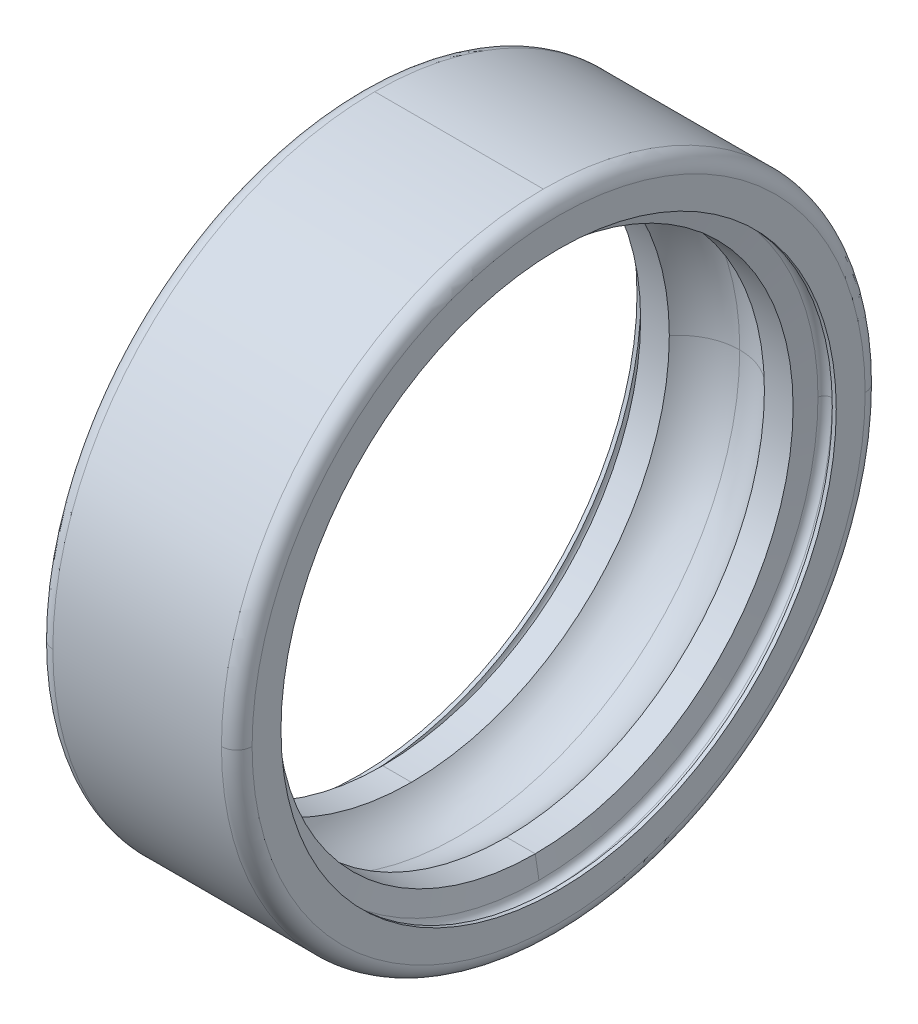
ISO-10303-21;
HEADER;
FILE_DESCRIPTION(('STEP AP214'),'2;1');
FILE_NAME('part.step','',(''),(''),'','','');
FILE_SCHEMA(('AUTOMOTIVE_DESIGN { 1 0 10303 214 1 1 1 1 }'));
ENDSEC;
DATA;
#1=APPLICATION_CONTEXT('core data for automotive mechanical design processes');
#2=APPLICATION_PROTOCOL_DEFINITION('international standard','automotive_design',2000,#1);
#3=PRODUCT_CONTEXT('',#1,'mechanical');
#4=PRODUCT('Part','Part','',(#3));
#5=PRODUCT_RELATED_PRODUCT_CATEGORY('part','',(#4));
#6=PRODUCT_DEFINITION_FORMATION('','',#4);
#7=PRODUCT_DEFINITION_CONTEXT('part definition',#1,'design');
#8=PRODUCT_DEFINITION('design','',#6,#7);
#9=PRODUCT_DEFINITION_SHAPE('','',#8);
#10=(LENGTH_UNIT() NAMED_UNIT(*) SI_UNIT(.MILLI.,.METRE.));
#11=(NAMED_UNIT(*) PLANE_ANGLE_UNIT() SI_UNIT($,.RADIAN.));
#12=(NAMED_UNIT(*) SI_UNIT($,.STERADIAN.) SOLID_ANGLE_UNIT());
#13=UNCERTAINTY_MEASURE_WITH_UNIT(LENGTH_MEASURE(1.E-05),#10,'distance_accuracy_value','');
#14=(GEOMETRIC_REPRESENTATION_CONTEXT(3) GLOBAL_UNCERTAINTY_ASSIGNED_CONTEXT((#13)) GLOBAL_UNIT_ASSIGNED_CONTEXT((#10,
#11,#12)) REPRESENTATION_CONTEXT('',''));
#15=CARTESIAN_POINT('',(0.,0.,0.));
#16=DIRECTION('',(0.,0.,1.));
#17=DIRECTION('',(1.,0.,0.));
#18=AXIS2_PLACEMENT_3D('',#15,#16,#17);
#19=CARTESIAN_POINT('',(12.226,0.,0.));
#20=DIRECTION('',(1.,0.,0.));
#21=DIRECTION('',(0.,0.,-1.));
#22=AXIS2_PLACEMENT_3D('',#19,#20,#21);
#23=TOROIDAL_SURFACE('',#22,18.115,0.516);
#24=CARTESIAN_POINT('',(12.226,0.,0.));
#25=DIRECTION('',(1.,0.,0.));
#26=DIRECTION('',(0.,0.,1.));
#27=AXIS2_PLACEMENT_3D('',#24,#25,#26);
#28=CIRCLE('',#27,18.631);
#29=CARTESIAN_POINT('',(12.226,0.,-18.631));
#30=VERTEX_POINT('',#29);
#31=CARTESIAN_POINT('',(12.226,0.,18.631));
#32=VERTEX_POINT('',#31);
#33=EDGE_CURVE('E206',#30,#32,#28,.T.);
#34=ORIENTED_EDGE('',*,*,#33,.T.);
#35=CARTESIAN_POINT('',(12.226,0.,18.115));
#36=DIRECTION('',(0.,-1.,0.));
#37=DIRECTION('',(0.,0.,1.));
#38=AXIS2_PLACEMENT_3D('',#35,#36,#37);
#39=CIRCLE('',#38,0.516);
#40=CARTESIAN_POINT('',(11.7178391994457,0.,18.2046024596761));
#41=VERTEX_POINT('',#40);
#42=EDGE_CURVE('E204',#32,#41,#39,.T.);
#43=ORIENTED_EDGE('',*,*,#42,.T.);
#44=CARTESIAN_POINT('',(11.7178391994457,0.,0.));
#45=DIRECTION('',(1.,0.,0.));
#46=DIRECTION('',(0.,1.,0.));
#47=AXIS2_PLACEMENT_3D('',#44,#45,#46);
#48=CIRCLE('',#47,18.2046024596761);
#49=CARTESIAN_POINT('',(11.7178391994457,18.2046024596761,0.));
#50=VERTEX_POINT('',#49);
#51=EDGE_CURVE('E31',#50,#41,#48,.T.);
#52=ORIENTED_EDGE('',*,*,#51,.F.);
#53=CARTESIAN_POINT('',(11.7178391994457,0.,0.));
#54=DIRECTION('',(1.,0.,0.));
#55=DIRECTION('',(0.,1.,0.));
#56=AXIS2_PLACEMENT_3D('',#53,#54,#55);
#57=CIRCLE('',#56,18.2046024596761);
#58=CARTESIAN_POINT('',(11.7178391994457,0.,-18.2046024596761));
#59=VERTEX_POINT('',#58);
#60=EDGE_CURVE('E201',#59,#50,#57,.T.);
#61=ORIENTED_EDGE('',*,*,#60,.F.);
#62=CARTESIAN_POINT('',(12.226,0.,-18.115));
#63=DIRECTION('',(0.,-1.,0.));
#64=DIRECTION('',(0.,0.,-1.));
#65=AXIS2_PLACEMENT_3D('',#62,#63,#64);
#66=CIRCLE('',#65,0.516);
#67=EDGE_CURVE('E216',#59,#30,#66,.T.);
#68=ORIENTED_EDGE('',*,*,#67,.T.);
#69=EDGE_LOOP('',(#34,#43,#52,#61,#68));
#70=FACE_BOUND('',#69,.T.);
#71=ADVANCED_FACE('F15',(#70),#23,.F.);
#72=CARTESIAN_POINT('',(12.871,0.,0.));
#73=DIRECTION('',(1.,0.,0.));
#74=DIRECTION('',(0.,1.,0.));
#75=AXIS2_PLACEMENT_3D('',#72,#73,#74);
#76=CYLINDRICAL_SURFACE('',#75,18.115);
#77=DIRECTION('',(1.,0.,0.));
#78=VECTOR('',#77,1.);
#79=CARTESIAN_POINT('',(12.871,18.115,0.));
#80=LINE('',#79,#78);
#81=CARTESIAN_POINT('',(12.742,18.115,0.));
#82=VERTEX_POINT('',#81);
#83=CARTESIAN_POINT('',(13.,18.115,0.));
#84=VERTEX_POINT('',#83);
#85=EDGE_CURVE('E210',#82,#84,#80,.T.);
#86=ORIENTED_EDGE('',*,*,#85,.T.);
#87=CARTESIAN_POINT('',(13.,0.,0.));
#88=DIRECTION('',(1.,0.,0.));
#89=DIRECTION('',(0.,1.,0.));
#90=AXIS2_PLACEMENT_3D('',#87,#88,#89);
#91=CIRCLE('',#90,18.115);
#92=CARTESIAN_POINT('',(13.,-18.115,0.));
#93=VERTEX_POINT('',#92);
#94=EDGE_CURVE('E10',#84,#93,#91,.T.);
#95=ORIENTED_EDGE('',*,*,#94,.T.);
#96=DIRECTION('',(-1.,0.,0.));
#97=VECTOR('',#96,1.);
#98=CARTESIAN_POINT('',(12.871,-18.115,0.));
#99=LINE('',#98,#97);
#100=CARTESIAN_POINT('',(12.742,-18.115,0.));
#101=VERTEX_POINT('',#100);
#102=EDGE_CURVE('E227',#93,#101,#99,.T.);
#103=ORIENTED_EDGE('',*,*,#102,.T.);
#104=CARTESIAN_POINT('',(12.742,0.,0.));
#105=DIRECTION('',(1.,0.,0.));
#106=DIRECTION('',(0.,1.,0.));
#107=AXIS2_PLACEMENT_3D('',#104,#105,#106);
#108=CIRCLE('',#107,18.115);
#109=CARTESIAN_POINT('',(12.742,0.,18.115));
#110=VERTEX_POINT('',#109);
#111=EDGE_CURVE('E326',#110,#101,#108,.T.);
#112=ORIENTED_EDGE('',*,*,#111,.F.);
#113=CARTESIAN_POINT('',(12.742,0.,0.));
#114=DIRECTION('',(1.,0.,0.));
#115=DIRECTION('',(0.,1.,0.));
#116=AXIS2_PLACEMENT_3D('',#113,#114,#115);
#117=CIRCLE('',#116,18.115);
#118=EDGE_CURVE('E431',#82,#110,#117,.T.);
#119=ORIENTED_EDGE('',*,*,#118,.F.);
#120=EDGE_LOOP('',(#86,#95,#103,#112,#119));
#121=FACE_BOUND('',#120,.T.);
#122=ADVANCED_FACE('F463',(#121),#76,.F.);
#123=CARTESIAN_POINT('',(13.,19.0575,0.));
#124=DIRECTION('',(1.,0.,0.));
#125=DIRECTION('',(0.,1.,0.));
#126=AXIS2_PLACEMENT_3D('',#123,#124,#125);
#127=PLANE('',#126);
#128=ORIENTED_EDGE('',*,*,#94,.F.);
#129=CARTESIAN_POINT('',(13.,0.,0.));
#130=DIRECTION('',(1.,0.,0.));
#131=DIRECTION('',(0.,1.,0.));
#132=AXIS2_PLACEMENT_3D('',#129,#130,#131);
#133=CIRCLE('',#132,18.115);
#134=EDGE_CURVE('E231',#93,#84,#133,.T.);
#135=ORIENTED_EDGE('',*,*,#134,.F.);
#136=EDGE_LOOP('',(#128,#135));
#137=FACE_BOUND('',#136,.T.);
#138=CARTESIAN_POINT('',(13.,0.,0.));
#139=DIRECTION('',(1.,0.,0.));
#140=DIRECTION('',(0.,1.,0.));
#141=AXIS2_PLACEMENT_3D('',#138,#139,#140);
#142=CIRCLE('',#141,20.);
#143=CARTESIAN_POINT('',(13.,0.,20.));
#144=VERTEX_POINT('',#143);
#145=CARTESIAN_POINT('',(13.,0.,-20.));
#146=VERTEX_POINT('',#145);
#147=EDGE_CURVE('E23',#144,#146,#142,.T.);
#148=ORIENTED_EDGE('',*,*,#147,.T.);
#149=CARTESIAN_POINT('',(13.,0.,0.));
#150=DIRECTION('',(1.,0.,0.));
#151=DIRECTION('',(0.,1.,0.));
#152=AXIS2_PLACEMENT_3D('',#149,#150,#151);
#153=CIRCLE('',#152,20.);
#154=EDGE_CURVE('E237',#146,#144,#153,.T.);
#155=ORIENTED_EDGE('',*,*,#154,.T.);
#156=EDGE_LOOP('',(#148,#155));
#157=FACE_BOUND('',#156,.T.);
#158=ADVANCED_FACE('F484',(#137,#157),#127,.T.);
#159=CARTESIAN_POINT('',(12.,0.,0.));
#160=DIRECTION('',(1.,0.,0.));
#161=DIRECTION('',(0.,0.,-1.));
#162=AXIS2_PLACEMENT_3D('',#159,#160,#161);
#163=TOROIDAL_SURFACE('',#162,20.,1.);
#164=CARTESIAN_POINT('',(12.,0.,-20.));
#165=DIRECTION('',(0.,-1.,0.));
#166=DIRECTION('',(0.,0.,-1.));
#167=AXIS2_PLACEMENT_3D('',#164,#165,#166);
#168=CIRCLE('',#167,1.);
#169=CARTESIAN_POINT('',(12.,0.,-21.));
#170=VERTEX_POINT('',#169);
#171=EDGE_CURVE('E234',#170,#146,#168,.T.);
#172=ORIENTED_EDGE('',*,*,#171,.T.);
#173=ORIENTED_EDGE('',*,*,#147,.F.);
#174=CARTESIAN_POINT('',(12.,0.,20.));
#175=DIRECTION('',(0.,-1.,0.));
#176=DIRECTION('',(0.,0.,1.));
#177=AXIS2_PLACEMENT_3D('',#174,#175,#176);
#178=CIRCLE('',#177,1.);
#179=CARTESIAN_POINT('',(12.,0.,21.));
#180=VERTEX_POINT('',#179);
#181=EDGE_CURVE('E240',#144,#180,#178,.T.);
#182=ORIENTED_EDGE('',*,*,#181,.T.);
#183=CARTESIAN_POINT('',(12.,0.,0.));
#184=DIRECTION('',(1.,0.,0.));
#185=DIRECTION('',(0.,1.,0.));
#186=AXIS2_PLACEMENT_3D('',#183,#184,#185);
#187=CIRCLE('',#186,21.);
#188=CARTESIAN_POINT('',(12.,-21.,0.));
#189=VERTEX_POINT('',#188);
#190=EDGE_CURVE('E251',#180,#189,#187,.T.);
#191=ORIENTED_EDGE('',*,*,#190,.T.);
#192=CARTESIAN_POINT('',(12.,0.,0.));
#193=DIRECTION('',(1.,0.,0.));
#194=DIRECTION('',(0.,1.,0.));
#195=AXIS2_PLACEMENT_3D('',#192,#193,#194);
#196=CIRCLE('',#195,21.);
#197=EDGE_CURVE('E115',#189,#170,#196,.T.);
#198=ORIENTED_EDGE('',*,*,#197,.T.);
#199=EDGE_LOOP('',(#172,#173,#182,#191,#198));
#200=FACE_BOUND('',#199,.T.);
#201=ADVANCED_FACE('F422',(#200),#163,.T.);
#202=CARTESIAN_POINT('',(6.5,0.,0.));
#203=DIRECTION('',(1.,0.,0.));
#204=DIRECTION('',(0.,1.,0.));
#205=AXIS2_PLACEMENT_3D('',#202,#203,#204);
#206=CYLINDRICAL_SURFACE('',#205,21.);
#207=DIRECTION('',(1.,0.,0.));
#208=VECTOR('',#207,1.);
#209=CARTESIAN_POINT('',(6.5,21.,0.));
#210=LINE('',#209,#208);
#211=CARTESIAN_POINT('',(1.,21.,0.));
#212=VERTEX_POINT('',#211);
#213=CARTESIAN_POINT('',(12.,21.,0.));
#214=VERTEX_POINT('',#213);
#215=EDGE_CURVE('E239',#212,#214,#210,.T.);
#216=ORIENTED_EDGE('',*,*,#215,.T.);
#217=CARTESIAN_POINT('',(12.,0.,0.));
#218=DIRECTION('',(1.,0.,0.));
#219=DIRECTION('',(0.,1.,0.));
#220=AXIS2_PLACEMENT_3D('',#217,#218,#219);
#221=CIRCLE('',#220,21.);
#222=EDGE_CURVE('E236',#170,#214,#221,.T.);
#223=ORIENTED_EDGE('',*,*,#222,.F.);
#224=ORIENTED_EDGE('',*,*,#197,.F.);
#225=DIRECTION('',(-1.,0.,0.));
#226=VECTOR('',#225,1.);
#227=CARTESIAN_POINT('',(6.5,-21.,0.));
#228=LINE('',#227,#226);
#229=CARTESIAN_POINT('',(1.,-21.,0.));
#230=VERTEX_POINT('',#229);
#231=EDGE_CURVE('E248',#189,#230,#228,.T.);
#232=ORIENTED_EDGE('',*,*,#231,.T.);
#233=CARTESIAN_POINT('',(1.,0.,0.));
#234=DIRECTION('',(1.,0.,0.));
#235=DIRECTION('',(0.,1.,0.));
#236=AXIS2_PLACEMENT_3D('',#233,#234,#235);
#237=CIRCLE('',#236,21.);
#238=CARTESIAN_POINT('',(1.,0.,-21.));
#239=VERTEX_POINT('',#238);
#240=EDGE_CURVE('E312',#230,#239,#237,.T.);
#241=ORIENTED_EDGE('',*,*,#240,.T.);
#242=CARTESIAN_POINT('',(1.,0.,0.));
#243=DIRECTION('',(1.,0.,0.));
#244=DIRECTION('',(0.,1.,0.));
#245=AXIS2_PLACEMENT_3D('',#242,#243,#244);
#246=CIRCLE('',#245,21.);
#247=EDGE_CURVE('E262',#239,#212,#246,.T.);
#248=ORIENTED_EDGE('',*,*,#247,.T.);
#249=EDGE_LOOP('',(#216,#223,#224,#232,#241,#248));
#250=FACE_BOUND('',#249,.T.);
#251=ADVANCED_FACE('F417',(#250),#206,.T.);
#252=CARTESIAN_POINT('',(1.,0.,0.));
#253=DIRECTION('',(1.,0.,0.));
#254=DIRECTION('',(0.,0.,-1.));
#255=AXIS2_PLACEMENT_3D('',#252,#253,#254);
#256=TOROIDAL_SURFACE('',#255,20.,1.);
#257=CARTESIAN_POINT('',(1.,0.,-20.));
#258=DIRECTION('',(0.,-1.,0.));
#259=DIRECTION('',(0.,0.,-1.));
#260=AXIS2_PLACEMENT_3D('',#257,#258,#259);
#261=CIRCLE('',#260,1.);
#262=CARTESIAN_POINT('',(0.,0.,-20.));
#263=VERTEX_POINT('',#262);
#264=EDGE_CURVE('E253',#263,#239,#261,.T.);
#265=ORIENTED_EDGE('',*,*,#264,.T.);
#266=ORIENTED_EDGE('',*,*,#240,.F.);
#267=CARTESIAN_POINT('',(1.,0.,0.));
#268=DIRECTION('',(1.,0.,0.));
#269=DIRECTION('',(0.,1.,0.));
#270=AXIS2_PLACEMENT_3D('',#267,#268,#269);
#271=CIRCLE('',#270,21.);
#272=CARTESIAN_POINT('',(1.,0.,21.));
#273=VERTEX_POINT('',#272);
#274=EDGE_CURVE('E245',#273,#230,#271,.T.);
#275=ORIENTED_EDGE('',*,*,#274,.F.);
#276=CARTESIAN_POINT('',(1.,0.,20.));
#277=DIRECTION('',(0.,-1.,0.));
#278=DIRECTION('',(0.,0.,1.));
#279=AXIS2_PLACEMENT_3D('',#276,#277,#278);
#280=CIRCLE('',#279,1.);
#281=CARTESIAN_POINT('',(0.,0.,20.));
#282=VERTEX_POINT('',#281);
#283=EDGE_CURVE('E259',#273,#282,#280,.T.);
#284=ORIENTED_EDGE('',*,*,#283,.T.);
#285=CARTESIAN_POINT('',(0.,0.,0.));
#286=DIRECTION('',(1.,0.,0.));
#287=DIRECTION('',(0.,1.,0.));
#288=AXIS2_PLACEMENT_3D('',#285,#286,#287);
#289=CIRCLE('',#288,20.);
#290=EDGE_CURVE('E310',#282,#263,#289,.T.);
#291=ORIENTED_EDGE('',*,*,#290,.T.);
#292=EDGE_LOOP('',(#265,#266,#275,#284,#291));
#293=FACE_BOUND('',#292,.T.);
#294=ADVANCED_FACE('F399',(#293),#256,.T.);
#295=CARTESIAN_POINT('',(0.,19.0575,0.));
#296=DIRECTION('',(-1.,0.,0.));
#297=DIRECTION('',(0.,0.,1.));
#298=AXIS2_PLACEMENT_3D('',#295,#296,#297);
#299=PLANE('',#298);
#300=CARTESIAN_POINT('',(0.,0.,0.));
#301=DIRECTION('',(1.,0.,0.));
#302=DIRECTION('',(0.,1.,0.));
#303=AXIS2_PLACEMENT_3D('',#300,#301,#302);
#304=CIRCLE('',#303,18.115);
#305=CARTESIAN_POINT('',(0.,18.115,0.));
#306=VERTEX_POINT('',#305);
#307=CARTESIAN_POINT('',(0.,-18.115,0.));
#308=VERTEX_POINT('',#307);
#309=EDGE_CURVE('E307',#306,#308,#304,.T.);
#310=ORIENTED_EDGE('',*,*,#309,.T.);
#311=CARTESIAN_POINT('',(0.,0.,0.));
#312=DIRECTION('',(1.,0.,0.));
#313=DIRECTION('',(0.,1.,0.));
#314=AXIS2_PLACEMENT_3D('',#311,#312,#313);
#315=CIRCLE('',#314,18.115);
#316=EDGE_CURVE('E267',#308,#306,#315,.T.);
#317=ORIENTED_EDGE('',*,*,#316,.T.);
#318=EDGE_LOOP('',(#310,#317));
#319=FACE_BOUND('',#318,.T.);
#320=CARTESIAN_POINT('',(0.,0.,0.));
#321=DIRECTION('',(1.,0.,0.));
#322=DIRECTION('',(0.,1.,0.));
#323=AXIS2_PLACEMENT_3D('',#320,#321,#322);
#324=CIRCLE('',#323,20.);
#325=EDGE_CURVE('E256',#263,#282,#324,.T.);
#326=ORIENTED_EDGE('',*,*,#325,.F.);
#327=ORIENTED_EDGE('',*,*,#290,.F.);
#328=EDGE_LOOP('',(#326,#327));
#329=FACE_BOUND('',#328,.T.);
#330=ADVANCED_FACE('F396',(#319,#329),#299,.T.);
#331=CARTESIAN_POINT('',(0.129,0.,0.));
#332=DIRECTION('',(1.,0.,0.));
#333=DIRECTION('',(0.,1.,0.));
#334=AXIS2_PLACEMENT_3D('',#331,#332,#333);
#335=CYLINDRICAL_SURFACE('',#334,18.115);
#336=DIRECTION('',(1.,0.,0.));
#337=VECTOR('',#336,1.);
#338=CARTESIAN_POINT('',(0.129,18.115,0.));
#339=LINE('',#338,#337);
#340=CARTESIAN_POINT('',(0.258,18.115,0.));
#341=VERTEX_POINT('',#340);
#342=EDGE_CURVE('E264',#306,#341,#339,.T.);
#343=ORIENTED_EDGE('',*,*,#342,.T.);
#344=CARTESIAN_POINT('',(0.258,0.,0.));
#345=DIRECTION('',(1.,0.,0.));
#346=DIRECTION('',(0.,1.,0.));
#347=AXIS2_PLACEMENT_3D('',#344,#345,#346);
#348=CIRCLE('',#347,18.115);
#349=CARTESIAN_POINT('',(0.258,0.,18.115));
#350=VERTEX_POINT('',#349);
#351=EDGE_CURVE('E305',#341,#350,#348,.T.);
#352=ORIENTED_EDGE('',*,*,#351,.T.);
#353=CARTESIAN_POINT('',(0.258,0.,0.));
#354=DIRECTION('',(1.,0.,0.));
#355=DIRECTION('',(0.,1.,0.));
#356=AXIS2_PLACEMENT_3D('',#353,#354,#355);
#357=CIRCLE('',#356,18.115);
#358=CARTESIAN_POINT('',(0.258,-18.115,0.));
#359=VERTEX_POINT('',#358);
#360=EDGE_CURVE('E275',#350,#359,#357,.T.);
#361=ORIENTED_EDGE('',*,*,#360,.T.);
#362=DIRECTION('',(-1.,0.,0.));
#363=VECTOR('',#362,1.);
#364=CARTESIAN_POINT('',(0.129,-18.115,0.));
#365=LINE('',#364,#363);
#366=EDGE_CURVE('E272',#359,#308,#365,.T.);
#367=ORIENTED_EDGE('',*,*,#366,.T.);
#368=ORIENTED_EDGE('',*,*,#309,.F.);
#369=EDGE_LOOP('',(#343,#352,#361,#367,#368));
#370=FACE_BOUND('',#369,.T.);
#371=ADVANCED_FACE('F387',(#370),#335,.F.);
#372=CARTESIAN_POINT('',(0.774,0.,0.));
#373=DIRECTION('',(1.,0.,0.));
#374=DIRECTION('',(0.,0.,-1.));
#375=AXIS2_PLACEMENT_3D('',#372,#373,#374);
#376=TOROIDAL_SURFACE('',#375,18.115,0.516);
#377=CARTESIAN_POINT('',(0.774,0.,0.));
#378=DIRECTION('',(1.,0.,0.));
#379=DIRECTION('',(0.,0.,1.));
#380=AXIS2_PLACEMENT_3D('',#377,#378,#379);
#381=CIRCLE('',#380,18.631);
#382=CARTESIAN_POINT('',(0.774,0.,-18.631));
#383=VERTEX_POINT('',#382);
#384=CARTESIAN_POINT('',(0.774,0.,18.631));
#385=VERTEX_POINT('',#384);
#386=EDGE_CURVE('E363',#383,#385,#381,.T.);
#387=ORIENTED_EDGE('',*,*,#386,.T.);
#388=CARTESIAN_POINT('',(0.774,0.,18.115));
#389=DIRECTION('',(0.,-1.,0.));
#390=DIRECTION('',(0.,0.,1.));
#391=AXIS2_PLACEMENT_3D('',#388,#389,#390);
#392=CIRCLE('',#391,0.516);
#393=EDGE_CURVE('E277',#385,#350,#392,.T.);
#394=ORIENTED_EDGE('',*,*,#393,.T.);
#395=ORIENTED_EDGE('',*,*,#351,.F.);
#396=CARTESIAN_POINT('',(0.258,0.,0.));
#397=DIRECTION('',(1.,0.,0.));
#398=DIRECTION('',(0.,1.,0.));
#399=AXIS2_PLACEMENT_3D('',#396,#397,#398);
#400=CIRCLE('',#399,18.115);
#401=CARTESIAN_POINT('',(0.258,0.,-18.115));
#402=VERTEX_POINT('',#401);
#403=EDGE_CURVE('E271',#402,#341,#400,.T.);
#404=ORIENTED_EDGE('',*,*,#403,.F.);
#405=CARTESIAN_POINT('',(0.774,0.,-18.115));
#406=DIRECTION('',(0.,-1.,0.));
#407=DIRECTION('',(0.,0.,-1.));
#408=AXIS2_PLACEMENT_3D('',#405,#406,#407);
#409=CIRCLE('',#408,0.516);
#410=EDGE_CURVE('E273',#402,#383,#409,.T.);
#411=ORIENTED_EDGE('',*,*,#410,.T.);
#412=EDGE_LOOP('',(#387,#394,#395,#404,#411));
#413=FACE_BOUND('',#412,.T.);
#414=ADVANCED_FACE('F497',(#413),#376,.F.);
#415=CARTESIAN_POINT('',(1.40379136870063,0.,0.));
#416=DIRECTION('',(-1.,0.,0.));
#417=DIRECTION('',(0.,1.,0.));
#418=AXIS2_PLACEMENT_3D('',#415,#416,#417);
#419=CONICAL_SURFACE('',#418,17.5148012298381,1.39626340159546);
#420=DIRECTION('',(0.173648177666931,-0.984807753012208,0.));
#421=VECTOR('',#420,1.);
#422=CARTESIAN_POINT('',(1.40379136870063,17.5148012298381,0.));
#423=LINE('',#422,#421);
#424=CARTESIAN_POINT('',(1.2821608005543,18.2046024596761,0.));
#425=VERTEX_POINT('',#424);
#426=CARTESIAN_POINT('',(1.52542193684696,16.825,0.));
#427=VERTEX_POINT('',#426);
#428=EDGE_CURVE('E278',#425,#427,#423,.T.);
#429=ORIENTED_EDGE('',*,*,#428,.T.);
#430=CARTESIAN_POINT('',(1.52542193684696,0.,0.));
#431=DIRECTION('',(1.,0.,0.));
#432=DIRECTION('',(0.,1.,0.));
#433=AXIS2_PLACEMENT_3D('',#430,#431,#432);
#434=CIRCLE('',#433,16.825);
#435=CARTESIAN_POINT('',(1.52542193684696,-16.825,0.));
#436=VERTEX_POINT('',#435);
#437=EDGE_CURVE('E303',#427,#436,#434,.T.);
#438=ORIENTED_EDGE('',*,*,#437,.T.);
#439=DIRECTION('',(-0.173648177666931,-0.984807753012208,0.));
#440=VECTOR('',#439,1.);
#441=CARTESIAN_POINT('',(1.40379136870063,-17.5148012298381,0.));
#442=LINE('',#441,#440);
#443=CARTESIAN_POINT('',(1.2821608005543,-18.2046024596761,0.));
#444=VERTEX_POINT('',#443);
#445=EDGE_CURVE('E281',#436,#444,#442,.T.);
#446=ORIENTED_EDGE('',*,*,#445,.T.);
#447=CARTESIAN_POINT('',(1.2821608005543,0.,0.));
#448=DIRECTION('',(1.,0.,0.));
#449=DIRECTION('',(0.,1.,0.));
#450=AXIS2_PLACEMENT_3D('',#447,#448,#449);
#451=CIRCLE('',#450,18.2046024596761);
#452=CARTESIAN_POINT('',(1.2821608005543,0.,18.2046024596761));
#453=VERTEX_POINT('',#452);
#454=EDGE_CURVE('E321',#453,#444,#451,.T.);
#455=ORIENTED_EDGE('',*,*,#454,.F.);
#456=CARTESIAN_POINT('',(1.2821608005543,0.,0.));
#457=DIRECTION('',(1.,0.,0.));
#458=DIRECTION('',(0.,1.,0.));
#459=AXIS2_PLACEMENT_3D('',#456,#457,#458);
#460=CIRCLE('',#459,18.2046024596761);
#461=EDGE_CURVE('E348',#425,#453,#460,.T.);
#462=ORIENTED_EDGE('',*,*,#461,.F.);
#463=EDGE_LOOP('',(#429,#438,#446,#455,#462));
#464=FACE_BOUND('',#463,.T.);
#465=ADVANCED_FACE('F346',(#464),#419,.F.);
#466=CARTESIAN_POINT('',(2.46131353385038,0.,0.));
#467=DIRECTION('',(1.,0.,0.));
#468=DIRECTION('',(0.,1.,0.));
#469=AXIS2_PLACEMENT_3D('',#466,#467,#468);
#470=CYLINDRICAL_SURFACE('',#469,16.825);
#471=DIRECTION('',(1.,0.,0.));
#472=VECTOR('',#471,1.);
#473=CARTESIAN_POINT('',(2.46131353385038,16.825,0.));
#474=LINE('',#473,#472);
#475=CARTESIAN_POINT('',(3.3972051308538,16.825,0.));
#476=VERTEX_POINT('',#475);
#477=EDGE_CURVE('E283',#427,#476,#474,.T.);
#478=ORIENTED_EDGE('',*,*,#477,.T.);
#479=CARTESIAN_POINT('',(3.3972051308538,0.,0.));
#480=DIRECTION('',(1.,0.,0.));
#481=DIRECTION('',(0.,1.,0.));
#482=AXIS2_PLACEMENT_3D('',#479,#480,#481);
#483=CIRCLE('',#482,16.825);
#484=CARTESIAN_POINT('',(3.3972051308538,0.,16.825));
#485=VERTEX_POINT('',#484);
#486=EDGE_CURVE('E90',#476,#485,#483,.T.);
#487=ORIENTED_EDGE('',*,*,#486,.T.);
#488=CARTESIAN_POINT('',(3.3972051308538,0.,0.));
#489=DIRECTION('',(1.,0.,0.));
#490=DIRECTION('',(0.,1.,0.));
#491=AXIS2_PLACEMENT_3D('',#488,#489,#490);
#492=CIRCLE('',#491,16.825);
#493=CARTESIAN_POINT('',(3.3972051308538,-16.825,0.));
#494=VERTEX_POINT('',#493);
#495=EDGE_CURVE('E289',#485,#494,#492,.T.);
#496=ORIENTED_EDGE('',*,*,#495,.T.);
#497=DIRECTION('',(-1.,0.,0.));
#498=VECTOR('',#497,1.);
#499=CARTESIAN_POINT('',(2.46131353385038,-16.825,0.));
#500=LINE('',#499,#498);
#501=EDGE_CURVE('E224',#494,#436,#500,.T.);
#502=ORIENTED_EDGE('',*,*,#501,.T.);
#503=ORIENTED_EDGE('',*,*,#437,.F.);
#504=EDGE_LOOP('',(#478,#487,#496,#502,#503));
#505=FACE_BOUND('',#504,.T.);
#506=ADVANCED_FACE('F500',(#505),#470,.F.);
#507=CARTESIAN_POINT('',(6.5,0.,0.));
#508=DIRECTION('',(1.,0.,0.));
#509=DIRECTION('',(0.,0.,-1.));
#510=AXIS2_PLACEMENT_3D('',#507,#508,#509);
#511=TOROIDAL_SURFACE('',#510,14.35,3.969);
#512=CARTESIAN_POINT('',(6.5,0.,0.));
#513=DIRECTION('',(1.,0.,0.));
#514=DIRECTION('',(0.,0.,1.));
#515=AXIS2_PLACEMENT_3D('',#512,#513,#514);
#516=CIRCLE('',#515,18.319);
#517=CARTESIAN_POINT('',(6.5,0.,-18.319));
#518=VERTEX_POINT('',#517);
#519=CARTESIAN_POINT('',(6.5,0.,18.319));
#520=VERTEX_POINT('',#519);
#521=EDGE_CURVE('E368',#518,#520,#516,.T.);
#522=ORIENTED_EDGE('',*,*,#521,.T.);
#523=CARTESIAN_POINT('',(6.5,0.,14.35));
#524=DIRECTION('',(0.,-1.,0.));
#525=DIRECTION('',(0.,0.,1.));
#526=AXIS2_PLACEMENT_3D('',#523,#524,#525);
#527=CIRCLE('',#526,3.969);
#528=EDGE_CURVE('E291',#520,#485,#527,.T.);
#529=ORIENTED_EDGE('',*,*,#528,.T.);
#530=ORIENTED_EDGE('',*,*,#486,.F.);
#531=CARTESIAN_POINT('',(3.3972051308538,0.,0.));
#532=DIRECTION('',(1.,0.,0.));
#533=DIRECTION('',(0.,1.,0.));
#534=AXIS2_PLACEMENT_3D('',#531,#532,#533);
#535=CIRCLE('',#534,16.825);
#536=CARTESIAN_POINT('',(3.3972051308538,0.,-16.825));
#537=VERTEX_POINT('',#536);
#538=EDGE_CURVE('E223',#537,#476,#535,.T.);
#539=ORIENTED_EDGE('',*,*,#538,.F.);
#540=CARTESIAN_POINT('',(6.5,0.,-14.35));
#541=DIRECTION('',(0.,-1.,0.));
#542=DIRECTION('',(0.,0.,-1.));
#543=AXIS2_PLACEMENT_3D('',#540,#541,#542);
#544=CIRCLE('',#543,3.969);
#545=EDGE_CURVE('E99',#537,#518,#544,.T.);
#546=ORIENTED_EDGE('',*,*,#545,.T.);
#547=EDGE_LOOP('',(#522,#529,#530,#539,#546));
#548=FACE_BOUND('',#547,.T.);
#549=ADVANCED_FACE('F503',(#548),#511,.F.);
#550=CARTESIAN_POINT('',(10.5386864661496,0.,0.));
#551=DIRECTION('',(1.,0.,0.));
#552=DIRECTION('',(0.,1.,0.));
#553=AXIS2_PLACEMENT_3D('',#550,#551,#552);
#554=CYLINDRICAL_SURFACE('',#553,16.825);
#555=DIRECTION('',(1.,0.,0.));
#556=VECTOR('',#555,1.);
#557=CARTESIAN_POINT('',(10.5386864661496,16.825,0.));
#558=LINE('',#557,#556);
#559=CARTESIAN_POINT('',(9.6027948691462,16.825,0.));
#560=VERTEX_POINT('',#559);
#561=CARTESIAN_POINT('',(11.474578063153,16.825,0.));
#562=VERTEX_POINT('',#561);
#563=EDGE_CURVE('E293',#560,#562,#558,.T.);
#564=ORIENTED_EDGE('',*,*,#563,.T.);
#565=CARTESIAN_POINT('',(11.474578063153,0.,0.));
#566=DIRECTION('',(1.,0.,0.));
#567=DIRECTION('',(0.,1.,0.));
#568=AXIS2_PLACEMENT_3D('',#565,#566,#567);
#569=CIRCLE('',#568,16.825);
#570=CARTESIAN_POINT('',(11.474578063153,-16.825,0.));
#571=VERTEX_POINT('',#570);
#572=EDGE_CURVE('E200',#562,#571,#569,.T.);
#573=ORIENTED_EDGE('',*,*,#572,.T.);
#574=DIRECTION('',(-1.,0.,0.));
#575=VECTOR('',#574,1.);
#576=CARTESIAN_POINT('',(10.5386864661496,-16.825,0.));
#577=LINE('',#576,#575);
#578=CARTESIAN_POINT('',(9.6027948691462,-16.825,0.));
#579=VERTEX_POINT('',#578);
#580=EDGE_CURVE('E296',#571,#579,#577,.T.);
#581=ORIENTED_EDGE('',*,*,#580,.T.);
#582=CARTESIAN_POINT('',(9.6027948691462,0.,0.));
#583=DIRECTION('',(1.,0.,0.));
#584=DIRECTION('',(0.,1.,0.));
#585=AXIS2_PLACEMENT_3D('',#582,#583,#584);
#586=CIRCLE('',#585,16.825);
#587=CARTESIAN_POINT('',(9.6027948691462,0.,16.825));
#588=VERTEX_POINT('',#587);
#589=EDGE_CURVE('E378',#588,#579,#586,.T.);
#590=ORIENTED_EDGE('',*,*,#589,.F.);
#591=CARTESIAN_POINT('',(9.6027948691462,0.,0.));
#592=DIRECTION('',(1.,0.,0.));
#593=DIRECTION('',(0.,1.,0.));
#594=AXIS2_PLACEMENT_3D('',#591,#592,#593);
#595=CIRCLE('',#594,16.825);
#596=EDGE_CURVE('E375',#560,#588,#595,.T.);
#597=ORIENTED_EDGE('',*,*,#596,.F.);
#598=EDGE_LOOP('',(#564,#573,#581,#590,#597));
#599=FACE_BOUND('',#598,.T.);
#600=ADVANCED_FACE('F478',(#599),#554,.F.);
#601=CARTESIAN_POINT('',(11.5962086312994,0.,0.));
#602=DIRECTION('',(1.,0.,0.));
#603=DIRECTION('',(0.,1.,0.));
#604=AXIS2_PLACEMENT_3D('',#601,#602,#603);
#605=CONICAL_SURFACE('',#604,17.5148012298381,1.39626340159546);
#606=DIRECTION('',(0.17364817766693,0.984807753012208,0.));
#607=VECTOR('',#606,1.);
#608=CARTESIAN_POINT('',(11.5962086312994,17.5148012298381,0.));
#609=LINE('',#608,#607);
#610=EDGE_CURVE('E199',#562,#50,#609,.T.);
#611=ORIENTED_EDGE('',*,*,#610,.T.);
#612=ORIENTED_EDGE('',*,*,#51,.T.);
#613=CARTESIAN_POINT('',(11.7178391994457,0.,0.));
#614=DIRECTION('',(1.,0.,0.));
#615=DIRECTION('',(0.,1.,0.));
#616=AXIS2_PLACEMENT_3D('',#613,#614,#615);
#617=CIRCLE('',#616,18.2046024596761);
#618=CARTESIAN_POINT('',(11.7178391994457,-18.2046024596761,0.));
#619=VERTEX_POINT('',#618);
#620=EDGE_CURVE('E196',#41,#619,#617,.T.);
#621=ORIENTED_EDGE('',*,*,#620,.T.);
#622=DIRECTION('',(-0.17364817766693,0.984807753012208,0.));
#623=VECTOR('',#622,1.);
#624=CARTESIAN_POINT('',(11.5962086312994,-17.5148012298381,0.));
#625=LINE('',#624,#623);
#626=EDGE_CURVE('E190',#619,#571,#625,.T.);
#627=ORIENTED_EDGE('',*,*,#626,.T.);
#628=ORIENTED_EDGE('',*,*,#572,.F.);
#629=EDGE_LOOP('',(#611,#612,#621,#627,#628));
#630=FACE_BOUND('',#629,.T.);
#631=ADVANCED_FACE('F194',(#630),#605,.F.);
#632=CARTESIAN_POINT('',(11.5962086312994,0.,0.));
#633=DIRECTION('',(1.,0.,0.));
#634=DIRECTION('',(0.,1.,0.));
#635=AXIS2_PLACEMENT_3D('',#632,#633,#634);
#636=CONICAL_SURFACE('',#635,17.5148012298381,1.39626340159546);
#637=ORIENTED_EDGE('',*,*,#610,.F.);
#638=CARTESIAN_POINT('',(11.474578063153,0.,0.));
#639=DIRECTION('',(1.,0.,0.));
#640=DIRECTION('',(0.,1.,0.));
#641=AXIS2_PLACEMENT_3D('',#638,#639,#640);
#642=CIRCLE('',#641,16.825);
#643=EDGE_CURVE('E297',#571,#562,#642,.T.);
#644=ORIENTED_EDGE('',*,*,#643,.F.);
#645=ORIENTED_EDGE('',*,*,#626,.F.);
#646=CARTESIAN_POINT('',(11.7178391994457,0.,0.));
#647=DIRECTION('',(1.,0.,0.));
#648=DIRECTION('',(0.,1.,0.));
#649=AXIS2_PLACEMENT_3D('',#646,#647,#648);
#650=CIRCLE('',#649,18.2046024596761);
#651=EDGE_CURVE('E214',#619,#59,#650,.T.);
#652=ORIENTED_EDGE('',*,*,#651,.T.);
#653=ORIENTED_EDGE('',*,*,#60,.T.);
#654=EDGE_LOOP('',(#637,#644,#645,#652,#653));
#655=FACE_BOUND('',#654,.T.);
#656=ADVANCED_FACE('F466',(#655),#636,.F.);
#657=CARTESIAN_POINT('',(10.5386864661496,0.,0.));
#658=DIRECTION('',(1.,0.,0.));
#659=DIRECTION('',(0.,1.,0.));
#660=AXIS2_PLACEMENT_3D('',#657,#658,#659);
#661=CYLINDRICAL_SURFACE('',#660,16.825);
#662=ORIENTED_EDGE('',*,*,#563,.F.);
#663=CARTESIAN_POINT('',(9.6027948691462,0.,0.));
#664=DIRECTION('',(1.,0.,0.));
#665=DIRECTION('',(0.,1.,0.));
#666=AXIS2_PLACEMENT_3D('',#663,#664,#665);
#667=CIRCLE('',#666,16.825);
#668=CARTESIAN_POINT('',(9.6027948691462,0.,-16.825));
#669=VERTEX_POINT('',#668);
#670=EDGE_CURVE('E372',#669,#560,#667,.T.);
#671=ORIENTED_EDGE('',*,*,#670,.F.);
#672=CARTESIAN_POINT('',(9.6027948691462,0.,0.));
#673=DIRECTION('',(1.,0.,0.));
#674=DIRECTION('',(0.,1.,0.));
#675=AXIS2_PLACEMENT_3D('',#672,#673,#674);
#676=CIRCLE('',#675,16.825);
#677=EDGE_CURVE('E316',#579,#669,#676,.T.);
#678=ORIENTED_EDGE('',*,*,#677,.F.);
#679=ORIENTED_EDGE('',*,*,#580,.F.);
#680=ORIENTED_EDGE('',*,*,#643,.T.);
#681=EDGE_LOOP('',(#662,#671,#678,#679,#680));
#682=FACE_BOUND('',#681,.T.);
#683=ADVANCED_FACE('F468',(#682),#661,.F.);
#684=CARTESIAN_POINT('',(6.5,0.,0.));
#685=DIRECTION('',(1.,0.,0.));
#686=DIRECTION('',(0.,0.,-1.));
#687=AXIS2_PLACEMENT_3D('',#684,#685,#686);
#688=TOROIDAL_SURFACE('',#687,14.35,3.969);
#689=CARTESIAN_POINT('',(6.5,0.,0.));
#690=DIRECTION('',(1.,0.,0.));
#691=DIRECTION('',(0.,0.,1.));
#692=AXIS2_PLACEMENT_3D('',#689,#690,#691);
#693=CIRCLE('',#692,18.319);
#694=EDGE_CURVE('E376',#520,#518,#693,.T.);
#695=ORIENTED_EDGE('',*,*,#694,.T.);
#696=ORIENTED_EDGE('',*,*,#545,.F.);
#697=CARTESIAN_POINT('',(3.3972051308538,0.,0.));
#698=DIRECTION('',(1.,0.,0.));
#699=DIRECTION('',(0.,1.,0.));
#700=AXIS2_PLACEMENT_3D('',#697,#698,#699);
#701=CIRCLE('',#700,16.825);
#702=EDGE_CURVE('E220',#494,#537,#701,.T.);
#703=ORIENTED_EDGE('',*,*,#702,.F.);
#704=ORIENTED_EDGE('',*,*,#495,.F.);
#705=ORIENTED_EDGE('',*,*,#528,.F.);
#706=EDGE_LOOP('',(#695,#696,#703,#704,#705));
#707=FACE_BOUND('',#706,.T.);
#708=ADVANCED_FACE('F475',(#707),#688,.F.);
#709=CARTESIAN_POINT('',(2.46131353385038,0.,0.));
#710=DIRECTION('',(1.,0.,0.));
#711=DIRECTION('',(0.,1.,0.));
#712=AXIS2_PLACEMENT_3D('',#709,#710,#711);
#713=CYLINDRICAL_SURFACE('',#712,16.825);
#714=ORIENTED_EDGE('',*,*,#477,.F.);
#715=CARTESIAN_POINT('',(1.52542193684696,0.,0.));
#716=DIRECTION('',(1.,0.,0.));
#717=DIRECTION('',(0.,1.,0.));
#718=AXIS2_PLACEMENT_3D('',#715,#716,#717);
#719=CIRCLE('',#718,16.825);
#720=EDGE_CURVE('E285',#436,#427,#719,.T.);
#721=ORIENTED_EDGE('',*,*,#720,.F.);
#722=ORIENTED_EDGE('',*,*,#501,.F.);
#723=ORIENTED_EDGE('',*,*,#702,.T.);
#724=ORIENTED_EDGE('',*,*,#538,.T.);
#725=EDGE_LOOP('',(#714,#721,#722,#723,#724));
#726=FACE_BOUND('',#725,.T.);
#727=ADVANCED_FACE('F528',(#726),#713,.F.);
#728=CARTESIAN_POINT('',(1.40379136870063,0.,0.));
#729=DIRECTION('',(-1.,0.,0.));
#730=DIRECTION('',(0.,1.,0.));
#731=AXIS2_PLACEMENT_3D('',#728,#729,#730);
#732=CONICAL_SURFACE('',#731,17.5148012298381,1.39626340159546);
#733=ORIENTED_EDGE('',*,*,#428,.F.);
#734=CARTESIAN_POINT('',(1.2821608005543,0.,0.));
#735=DIRECTION('',(1.,0.,0.));
#736=DIRECTION('',(0.,1.,0.));
#737=AXIS2_PLACEMENT_3D('',#734,#735,#736);
#738=CIRCLE('',#737,18.2046024596761);
#739=CARTESIAN_POINT('',(1.2821608005543,0.,-18.2046024596761));
#740=VERTEX_POINT('',#739);
#741=EDGE_CURVE('E355',#740,#425,#738,.T.);
#742=ORIENTED_EDGE('',*,*,#741,.F.);
#743=CARTESIAN_POINT('',(1.2821608005543,0.,0.));
#744=DIRECTION('',(1.,0.,0.));
#745=DIRECTION('',(0.,1.,0.));
#746=AXIS2_PLACEMENT_3D('',#743,#744,#745);
#747=CIRCLE('',#746,18.2046024596761);
#748=EDGE_CURVE('E322',#444,#740,#747,.T.);
#749=ORIENTED_EDGE('',*,*,#748,.F.);
#750=ORIENTED_EDGE('',*,*,#445,.F.);
#751=ORIENTED_EDGE('',*,*,#720,.T.);
#752=EDGE_LOOP('',(#733,#742,#749,#750,#751));
#753=FACE_BOUND('',#752,.T.);
#754=ADVANCED_FACE('F338',(#753),#732,.F.);
#755=CARTESIAN_POINT('',(0.774,0.,0.));
#756=DIRECTION('',(1.,0.,0.));
#757=DIRECTION('',(0.,0.,-1.));
#758=AXIS2_PLACEMENT_3D('',#755,#756,#757);
#759=TOROIDAL_SURFACE('',#758,18.115,0.516);
#760=CARTESIAN_POINT('',(0.774,0.,0.));
#761=DIRECTION('',(1.,0.,0.));
#762=DIRECTION('',(0.,0.,1.));
#763=AXIS2_PLACEMENT_3D('',#760,#761,#762);
#764=CIRCLE('',#763,18.631);
#765=EDGE_CURVE('E318',#385,#383,#764,.T.);
#766=ORIENTED_EDGE('',*,*,#765,.T.);
#767=ORIENTED_EDGE('',*,*,#410,.F.);
#768=CARTESIAN_POINT('',(0.258,0.,0.));
#769=DIRECTION('',(1.,0.,0.));
#770=DIRECTION('',(0.,1.,0.));
#771=AXIS2_PLACEMENT_3D('',#768,#769,#770);
#772=CIRCLE('',#771,18.115);
#773=EDGE_CURVE('E268',#359,#402,#772,.T.);
#774=ORIENTED_EDGE('',*,*,#773,.F.);
#775=ORIENTED_EDGE('',*,*,#360,.F.);
#776=ORIENTED_EDGE('',*,*,#393,.F.);
#777=EDGE_LOOP('',(#766,#767,#774,#775,#776));
#778=FACE_BOUND('',#777,.T.);
#779=ADVANCED_FACE('F535',(#778),#759,.F.);
#780=CARTESIAN_POINT('',(0.129,0.,0.));
#781=DIRECTION('',(1.,0.,0.));
#782=DIRECTION('',(0.,1.,0.));
#783=AXIS2_PLACEMENT_3D('',#780,#781,#782);
#784=CYLINDRICAL_SURFACE('',#783,18.115);
#785=ORIENTED_EDGE('',*,*,#342,.F.);
#786=ORIENTED_EDGE('',*,*,#316,.F.);
#787=ORIENTED_EDGE('',*,*,#366,.F.);
#788=ORIENTED_EDGE('',*,*,#773,.T.);
#789=ORIENTED_EDGE('',*,*,#403,.T.);
#790=EDGE_LOOP('',(#785,#786,#787,#788,#789));
#791=FACE_BOUND('',#790,.T.);
#792=ADVANCED_FACE('F393',(#791),#784,.F.);
#793=CARTESIAN_POINT('',(1.,0.,0.));
#794=DIRECTION('',(1.,0.,0.));
#795=DIRECTION('',(0.,0.,-1.));
#796=AXIS2_PLACEMENT_3D('',#793,#794,#795);
#797=TOROIDAL_SURFACE('',#796,20.,1.);
#798=ORIENTED_EDGE('',*,*,#264,.F.);
#799=ORIENTED_EDGE('',*,*,#325,.T.);
#800=ORIENTED_EDGE('',*,*,#283,.F.);
#801=CARTESIAN_POINT('',(1.,0.,0.));
#802=DIRECTION('',(1.,0.,0.));
#803=DIRECTION('',(0.,1.,0.));
#804=AXIS2_PLACEMENT_3D('',#801,#802,#803);
#805=CIRCLE('',#804,21.);
#806=EDGE_CURVE('E241',#212,#273,#805,.T.);
#807=ORIENTED_EDGE('',*,*,#806,.F.);
#808=ORIENTED_EDGE('',*,*,#247,.F.);
#809=EDGE_LOOP('',(#798,#799,#800,#807,#808));
#810=FACE_BOUND('',#809,.T.);
#811=ADVANCED_FACE('F405',(#810),#797,.T.);
#812=CARTESIAN_POINT('',(6.5,0.,0.));
#813=DIRECTION('',(1.,0.,0.));
#814=DIRECTION('',(0.,1.,0.));
#815=AXIS2_PLACEMENT_3D('',#812,#813,#814);
#816=CYLINDRICAL_SURFACE('',#815,21.);
#817=ORIENTED_EDGE('',*,*,#215,.F.);
#818=ORIENTED_EDGE('',*,*,#806,.T.);
#819=ORIENTED_EDGE('',*,*,#274,.T.);
#820=ORIENTED_EDGE('',*,*,#231,.F.);
#821=ORIENTED_EDGE('',*,*,#190,.F.);
#822=CARTESIAN_POINT('',(12.,0.,0.));
#823=DIRECTION('',(1.,0.,0.));
#824=DIRECTION('',(0.,1.,0.));
#825=AXIS2_PLACEMENT_3D('',#822,#823,#824);
#826=CIRCLE('',#825,21.);
#827=EDGE_CURVE('E414',#214,#180,#826,.T.);
#828=ORIENTED_EDGE('',*,*,#827,.F.);
#829=EDGE_LOOP('',(#817,#818,#819,#820,#821,#828));
#830=FACE_BOUND('',#829,.T.);
#831=ADVANCED_FACE('F412',(#830),#816,.T.);
#832=CARTESIAN_POINT('',(12.,0.,0.));
#833=DIRECTION('',(1.,0.,0.));
#834=DIRECTION('',(0.,0.,-1.));
#835=AXIS2_PLACEMENT_3D('',#832,#833,#834);
#836=TOROIDAL_SURFACE('',#835,20.,1.);
#837=ORIENTED_EDGE('',*,*,#171,.F.);
#838=ORIENTED_EDGE('',*,*,#222,.T.);
#839=ORIENTED_EDGE('',*,*,#827,.T.);
#840=ORIENTED_EDGE('',*,*,#181,.F.);
#841=ORIENTED_EDGE('',*,*,#154,.F.);
#842=EDGE_LOOP('',(#837,#838,#839,#840,#841));
#843=FACE_BOUND('',#842,.T.);
#844=ADVANCED_FACE('F425',(#843),#836,.T.);
#845=CARTESIAN_POINT('',(12.871,0.,0.));
#846=DIRECTION('',(1.,0.,0.));
#847=DIRECTION('',(0.,1.,0.));
#848=AXIS2_PLACEMENT_3D('',#845,#846,#847);
#849=CYLINDRICAL_SURFACE('',#848,18.115);
#850=ORIENTED_EDGE('',*,*,#85,.F.);
#851=CARTESIAN_POINT('',(12.742,0.,0.));
#852=DIRECTION('',(1.,0.,0.));
#853=DIRECTION('',(0.,1.,0.));
#854=AXIS2_PLACEMENT_3D('',#851,#852,#853);
#855=CIRCLE('',#854,18.115);
#856=CARTESIAN_POINT('',(12.742,0.,-18.115));
#857=VERTEX_POINT('',#856);
#858=EDGE_CURVE('E435',#857,#82,#855,.T.);
#859=ORIENTED_EDGE('',*,*,#858,.F.);
#860=CARTESIAN_POINT('',(12.742,0.,0.));
#861=DIRECTION('',(1.,0.,0.));
#862=DIRECTION('',(0.,1.,0.));
#863=AXIS2_PLACEMENT_3D('',#860,#861,#862);
#864=CIRCLE('',#863,18.115);
#865=EDGE_CURVE('E331',#101,#857,#864,.T.);
#866=ORIENTED_EDGE('',*,*,#865,.F.);
#867=ORIENTED_EDGE('',*,*,#102,.F.);
#868=ORIENTED_EDGE('',*,*,#134,.T.);
#869=EDGE_LOOP('',(#850,#859,#866,#867,#868));
#870=FACE_BOUND('',#869,.T.);
#871=ADVANCED_FACE('F459',(#870),#849,.F.);
#872=CARTESIAN_POINT('',(12.226,0.,0.));
#873=DIRECTION('',(1.,0.,0.));
#874=DIRECTION('',(0.,0.,-1.));
#875=AXIS2_PLACEMENT_3D('',#872,#873,#874);
#876=TOROIDAL_SURFACE('',#875,18.115,0.516);
#877=CARTESIAN_POINT('',(12.226,0.,0.));
#878=DIRECTION('',(1.,0.,0.));
#879=DIRECTION('',(0.,0.,1.));
#880=AXIS2_PLACEMENT_3D('',#877,#878,#879);
#881=CIRCLE('',#880,18.631);
#882=EDGE_CURVE('E324',#32,#30,#881,.T.);
#883=ORIENTED_EDGE('',*,*,#882,.T.);
#884=ORIENTED_EDGE('',*,*,#67,.F.);
#885=ORIENTED_EDGE('',*,*,#651,.F.);
#886=ORIENTED_EDGE('',*,*,#620,.F.);
#887=ORIENTED_EDGE('',*,*,#42,.F.);
#888=EDGE_LOOP('',(#883,#884,#885,#886,#887));
#889=FACE_BOUND('',#888,.T.);
#890=ADVANCED_FACE('F212',(#889),#876,.F.);
#891=CARTESIAN_POINT('',(12.226,0.,0.));
#892=DIRECTION('',(1.,0.,0.));
#893=DIRECTION('',(0.,0.,-1.));
#894=AXIS2_PLACEMENT_3D('',#891,#892,#893);
#895=TOROIDAL_SURFACE('',#894,18.115,0.516);
#896=ORIENTED_EDGE('',*,*,#882,.F.);
#897=CARTESIAN_POINT('',(12.226,0.,18.115));
#898=DIRECTION('',(0.,-1.,0.));
#899=DIRECTION('',(0.,0.,1.));
#900=AXIS2_PLACEMENT_3D('',#897,#898,#899);
#901=CIRCLE('',#900,0.516);
#902=EDGE_CURVE('E434',#110,#32,#901,.T.);
#903=ORIENTED_EDGE('',*,*,#902,.F.);
#904=ORIENTED_EDGE('',*,*,#111,.T.);
#905=ORIENTED_EDGE('',*,*,#865,.T.);
#906=CARTESIAN_POINT('',(12.226,0.,-18.115));
#907=DIRECTION('',(0.,-1.,0.));
#908=DIRECTION('',(0.,0.,-1.));
#909=AXIS2_PLACEMENT_3D('',#906,#907,#908);
#910=CIRCLE('',#909,0.516);
#911=EDGE_CURVE('E448',#30,#857,#910,.T.);
#912=ORIENTED_EDGE('',*,*,#911,.F.);
#913=EDGE_LOOP('',(#896,#903,#904,#905,#912));
#914=FACE_BOUND('',#913,.T.);
#915=ADVANCED_FACE('F465',(#914),#895,.F.);
#916=CARTESIAN_POINT('',(0.774,0.,0.));
#917=DIRECTION('',(1.,0.,0.));
#918=DIRECTION('',(0.,0.,-1.));
#919=AXIS2_PLACEMENT_3D('',#916,#917,#918);
#920=TOROIDAL_SURFACE('',#919,18.115,0.516);
#921=ORIENTED_EDGE('',*,*,#765,.F.);
#922=CARTESIAN_POINT('',(0.774,0.,18.115));
#923=DIRECTION('',(0.,-1.,0.));
#924=DIRECTION('',(0.,0.,1.));
#925=AXIS2_PLACEMENT_3D('',#922,#923,#924);
#926=CIRCLE('',#925,0.516);
#927=EDGE_CURVE('E354',#453,#385,#926,.T.);
#928=ORIENTED_EDGE('',*,*,#927,.F.);
#929=ORIENTED_EDGE('',*,*,#454,.T.);
#930=ORIENTED_EDGE('',*,*,#748,.T.);
#931=CARTESIAN_POINT('',(0.774,0.,-18.115));
#932=DIRECTION('',(0.,-1.,0.));
#933=DIRECTION('',(0.,0.,-1.));
#934=AXIS2_PLACEMENT_3D('',#931,#932,#933);
#935=CIRCLE('',#934,0.516);
#936=EDGE_CURVE('E361',#383,#740,#935,.T.);
#937=ORIENTED_EDGE('',*,*,#936,.F.);
#938=EDGE_LOOP('',(#921,#928,#929,#930,#937));
#939=FACE_BOUND('',#938,.T.);
#940=ADVANCED_FACE('F553',(#939),#920,.F.);
#941=CARTESIAN_POINT('',(6.5,0.,0.));
#942=DIRECTION('',(1.,0.,0.));
#943=DIRECTION('',(0.,0.,-1.));
#944=AXIS2_PLACEMENT_3D('',#941,#942,#943);
#945=TOROIDAL_SURFACE('',#944,14.35,3.969);
#946=ORIENTED_EDGE('',*,*,#694,.F.);
#947=CARTESIAN_POINT('',(6.5,0.,14.35));
#948=DIRECTION('',(0.,-1.,0.));
#949=DIRECTION('',(0.,0.,1.));
#950=AXIS2_PLACEMENT_3D('',#947,#948,#949);
#951=CIRCLE('',#950,3.969);
#952=EDGE_CURVE('E379',#588,#520,#951,.T.);
#953=ORIENTED_EDGE('',*,*,#952,.F.);
#954=ORIENTED_EDGE('',*,*,#589,.T.);
#955=ORIENTED_EDGE('',*,*,#677,.T.);
#956=CARTESIAN_POINT('',(6.5,0.,-14.35));
#957=DIRECTION('',(0.,-1.,0.));
#958=DIRECTION('',(0.,0.,-1.));
#959=AXIS2_PLACEMENT_3D('',#956,#957,#958);
#960=CIRCLE('',#959,3.969);
#961=EDGE_CURVE('E371',#518,#669,#960,.T.);
#962=ORIENTED_EDGE('',*,*,#961,.F.);
#963=EDGE_LOOP('',(#946,#953,#954,#955,#962));
#964=FACE_BOUND('',#963,.T.);
#965=ADVANCED_FACE('F522',(#964),#945,.F.);
#966=CARTESIAN_POINT('',(6.5,0.,0.));
#967=DIRECTION('',(1.,0.,0.));
#968=DIRECTION('',(0.,0.,-1.));
#969=AXIS2_PLACEMENT_3D('',#966,#967,#968);
#970=TOROIDAL_SURFACE('',#969,14.35,3.969);
#971=ORIENTED_EDGE('',*,*,#521,.F.);
#972=ORIENTED_EDGE('',*,*,#961,.T.);
#973=ORIENTED_EDGE('',*,*,#670,.T.);
#974=ORIENTED_EDGE('',*,*,#596,.T.);
#975=ORIENTED_EDGE('',*,*,#952,.T.);
#976=EDGE_LOOP('',(#971,#972,#973,#974,#975));
#977=FACE_BOUND('',#976,.T.);
#978=ADVANCED_FACE('F526',(#977),#970,.F.);
#979=CARTESIAN_POINT('',(0.774,0.,0.));
#980=DIRECTION('',(1.,0.,0.));
#981=DIRECTION('',(0.,0.,-1.));
#982=AXIS2_PLACEMENT_3D('',#979,#980,#981);
#983=TOROIDAL_SURFACE('',#982,18.115,0.516);
#984=ORIENTED_EDGE('',*,*,#386,.F.);
#985=ORIENTED_EDGE('',*,*,#936,.T.);
#986=ORIENTED_EDGE('',*,*,#741,.T.);
#987=ORIENTED_EDGE('',*,*,#461,.T.);
#988=ORIENTED_EDGE('',*,*,#927,.T.);
#989=EDGE_LOOP('',(#984,#985,#986,#987,#988));
#990=FACE_BOUND('',#989,.T.);
#991=ADVANCED_FACE('F359',(#990),#983,.F.);
#992=CARTESIAN_POINT('',(12.226,0.,0.));
#993=DIRECTION('',(1.,0.,0.));
#994=DIRECTION('',(0.,0.,-1.));
#995=AXIS2_PLACEMENT_3D('',#992,#993,#994);
#996=TOROIDAL_SURFACE('',#995,18.115,0.516);
#997=ORIENTED_EDGE('',*,*,#33,.F.);
#998=ORIENTED_EDGE('',*,*,#911,.T.);
#999=ORIENTED_EDGE('',*,*,#858,.T.);
#1000=ORIENTED_EDGE('',*,*,#118,.T.);
#1001=ORIENTED_EDGE('',*,*,#902,.T.);
#1002=EDGE_LOOP('',(#997,#998,#999,#1000,#1001));
#1003=FACE_BOUND('',#1002,.T.);
#1004=ADVANCED_FACE('F454',(#1003),#996,.F.);
#1005=CLOSED_SHELL('',(#71,#122,#158,#201,#251,#294,#330,#371,#414,#465,#506,#549,#600,#631,
#656,#683,#708,#727,#754,#779,#792,#811,#831,#844,#871,#890,#915,#940,#965,#978,#991,#1004));
#1006=MANIFOLD_SOLID_BREP('B1',#1005);
#1007=ADVANCED_BREP_SHAPE_REPRESENTATION('',(#18,#1006),#14);
#1008=SHAPE_DEFINITION_REPRESENTATION(#9,#1007);
ENDSEC;
END-ISO-10303-21;
